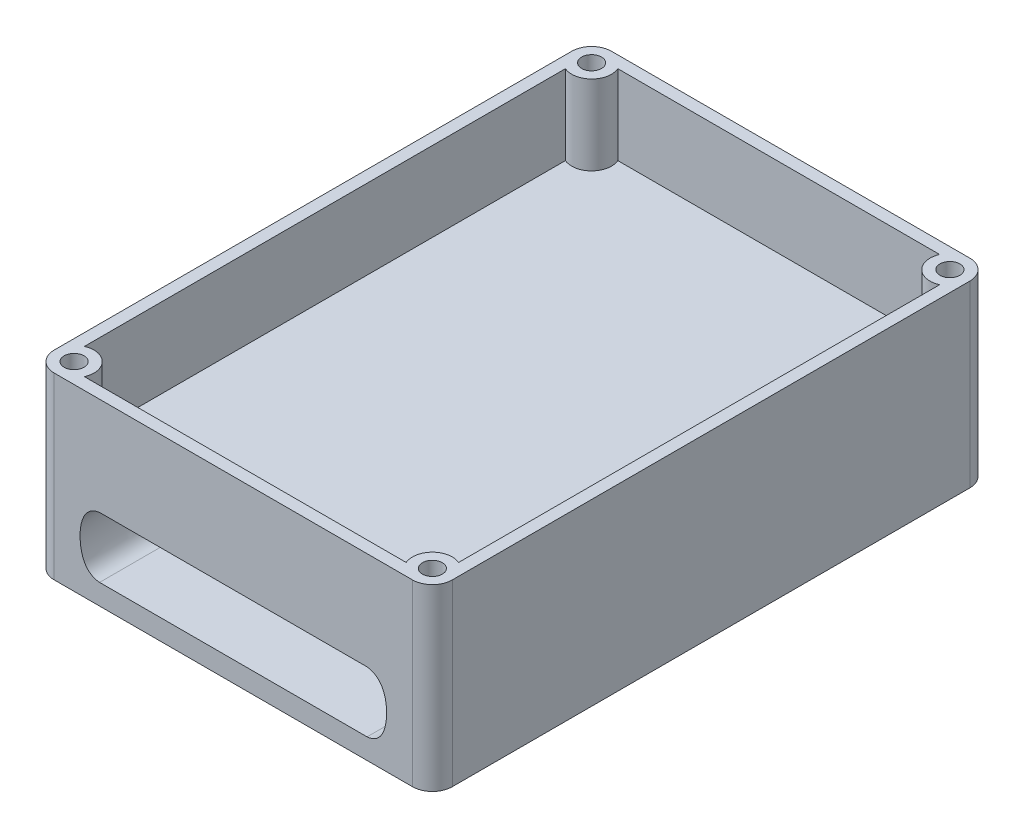
ISO-10303-21;
HEADER;
FILE_DESCRIPTION(('STEP AP214'),'2;1');
FILE_NAME('part.step','',(''),(''),'','','');
FILE_SCHEMA(('AUTOMOTIVE_DESIGN { 1 0 10303 214 1 1 1 1 }'));
ENDSEC;
DATA;
#1=APPLICATION_CONTEXT('core data for automotive mechanical design processes');
#2=APPLICATION_PROTOCOL_DEFINITION('international standard','automotive_design',2000,#1);
#3=PRODUCT_CONTEXT('',#1,'mechanical');
#4=PRODUCT('Part','Part','',(#3));
#5=PRODUCT_RELATED_PRODUCT_CATEGORY('part','',(#4));
#6=PRODUCT_DEFINITION_FORMATION('','',#4);
#7=PRODUCT_DEFINITION_CONTEXT('part definition',#1,'design');
#8=PRODUCT_DEFINITION('design','',#6,#7);
#9=PRODUCT_DEFINITION_SHAPE('','',#8);
#10=(LENGTH_UNIT() NAMED_UNIT(*) SI_UNIT(.MILLI.,.METRE.));
#11=(NAMED_UNIT(*) PLANE_ANGLE_UNIT() SI_UNIT($,.RADIAN.));
#12=(NAMED_UNIT(*) SI_UNIT($,.STERADIAN.) SOLID_ANGLE_UNIT());
#13=UNCERTAINTY_MEASURE_WITH_UNIT(LENGTH_MEASURE(1.E-05),#10,'distance_accuracy_value','');
#14=(GEOMETRIC_REPRESENTATION_CONTEXT(3) GLOBAL_UNCERTAINTY_ASSIGNED_CONTEXT((#13)) GLOBAL_UNIT_ASSIGNED_CONTEXT((#10,
#11,#12)) REPRESENTATION_CONTEXT('',''));
#15=CARTESIAN_POINT('',(0.,0.,0.));
#16=DIRECTION('',(0.,0.,1.));
#17=DIRECTION('',(1.,0.,0.));
#18=AXIS2_PLACEMENT_3D('',#15,#16,#17);
#19=CARTESIAN_POINT('',(0.,25.,-70.));
#20=DIRECTION('',(0.,0.,-1.));
#21=DIRECTION('',(-1.,0.,0.));
#22=AXIS2_PLACEMENT_3D('',#19,#20,#21);
#23=PLANE('',#22);
#24=DIRECTION('',(1.,0.,0.));
#25=VECTOR('',#24,1.);
#26=CARTESIAN_POINT('',(0.,0.,-70.));
#27=LINE('',#26,#25);
#28=CARTESIAN_POINT('',(-45.,0.,-70.));
#29=VERTEX_POINT('',#28);
#30=CARTESIAN_POINT('',(45.,0.,-70.));
#31=VERTEX_POINT('',#30);
#32=EDGE_CURVE('E579',#29,#31,#27,.T.);
#33=ORIENTED_EDGE('',*,*,#32,.F.);
#34=DIRECTION('',(0.,-1.,0.));
#35=VECTOR('',#34,1.);
#36=CARTESIAN_POINT('',(-45.,25.,-70.));
#37=LINE('',#36,#35);
#38=CARTESIAN_POINT('',(-45.,45.,-70.));
#39=VERTEX_POINT('',#38);
#40=EDGE_CURVE('E574',#39,#29,#37,.T.);
#41=ORIENTED_EDGE('',*,*,#40,.F.);
#42=DIRECTION('',(-1.,0.,0.));
#43=VECTOR('',#42,1.);
#44=CARTESIAN_POINT('',(0.,45.,-70.));
#45=LINE('',#44,#43);
#46=CARTESIAN_POINT('',(45.,45.,-70.));
#47=VERTEX_POINT('',#46);
#48=EDGE_CURVE('E983',#47,#39,#45,.T.);
#49=ORIENTED_EDGE('',*,*,#48,.F.);
#50=DIRECTION('',(0.,-1.,0.));
#51=VECTOR('',#50,1.);
#52=CARTESIAN_POINT('',(45.,25.,-70.));
#53=LINE('',#52,#51);
#54=EDGE_CURVE('E605',#47,#31,#53,.T.);
#55=ORIENTED_EDGE('',*,*,#54,.T.);
#56=EDGE_LOOP('',(#33,#41,#49,#55));
#57=FACE_BOUND('',#56,.T.);
#58=ADVANCED_FACE('F303',(#57),#23,.T.);
#59=CARTESIAN_POINT('',(-45.,25.,-65.));
#60=DIRECTION('',(0.,-1.,0.));
#61=DIRECTION('',(0.,0.,-1.));
#62=AXIS2_PLACEMENT_3D('',#59,#60,#61);
#63=CYLINDRICAL_SURFACE('',#62,5.00000000000001);
#64=CARTESIAN_POINT('',(-45.,0.,-65.));
#65=DIRECTION('',(0.,1.,0.));
#66=DIRECTION('',(0.,0.,1.));
#67=AXIS2_PLACEMENT_3D('',#64,#65,#66);
#68=CIRCLE('',#67,5.00000000000001);
#69=CARTESIAN_POINT('',(-50.,0.,-65.));
#70=VERTEX_POINT('',#69);
#71=EDGE_CURVE('E569',#29,#70,#68,.T.);
#72=ORIENTED_EDGE('',*,*,#71,.T.);
#73=DIRECTION('',(0.,-1.,0.));
#74=VECTOR('',#73,1.);
#75=CARTESIAN_POINT('',(-50.,25.,-65.));
#76=LINE('',#75,#74);
#77=CARTESIAN_POINT('',(-50.,45.,-65.));
#78=VERTEX_POINT('',#77);
#79=EDGE_CURVE('E572',#78,#70,#76,.T.);
#80=ORIENTED_EDGE('',*,*,#79,.F.);
#81=CARTESIAN_POINT('',(-45.,45.,-65.));
#82=DIRECTION('',(0.,1.,0.));
#83=DIRECTION('',(0.,0.,1.));
#84=AXIS2_PLACEMENT_3D('',#81,#82,#83);
#85=CIRCLE('',#84,5.00000000000001);
#86=EDGE_CURVE('E986',#39,#78,#85,.T.);
#87=ORIENTED_EDGE('',*,*,#86,.F.);
#88=ORIENTED_EDGE('',*,*,#40,.T.);
#89=EDGE_LOOP('',(#72,#80,#87,#88));
#90=FACE_BOUND('',#89,.T.);
#91=ADVANCED_FACE('F560',(#90),#63,.T.);
#92=CARTESIAN_POINT('',(-50.,25.,0.));
#93=DIRECTION('',(1.,0.,0.));
#94=DIRECTION('',(0.,0.,-1.));
#95=AXIS2_PLACEMENT_3D('',#92,#93,#94);
#96=PLANE('',#95);
#97=DIRECTION('',(0.,0.,1.));
#98=VECTOR('',#97,1.);
#99=CARTESIAN_POINT('',(-50.,0.,0.));
#100=LINE('',#99,#98);
#101=CARTESIAN_POINT('',(-50.,0.,65.));
#102=VERTEX_POINT('',#101);
#103=EDGE_CURVE('E578',#70,#102,#100,.T.);
#104=ORIENTED_EDGE('',*,*,#103,.T.);
#105=DIRECTION('',(0.,-1.,0.));
#106=VECTOR('',#105,1.);
#107=CARTESIAN_POINT('',(-50.,25.,65.));
#108=LINE('',#107,#106);
#109=CARTESIAN_POINT('',(-50.,45.,65.));
#110=VERTEX_POINT('',#109);
#111=EDGE_CURVE('E585',#110,#102,#108,.T.);
#112=ORIENTED_EDGE('',*,*,#111,.F.);
#113=DIRECTION('',(0.,0.,-1.));
#114=VECTOR('',#113,1.);
#115=CARTESIAN_POINT('',(-50.,45.,0.));
#116=LINE('',#115,#114);
#117=EDGE_CURVE('E584',#110,#78,#116,.T.);
#118=ORIENTED_EDGE('',*,*,#117,.T.);
#119=ORIENTED_EDGE('',*,*,#79,.T.);
#120=EDGE_LOOP('',(#104,#112,#118,#119));
#121=FACE_BOUND('',#120,.T.);
#122=ADVANCED_FACE('F557',(#121),#96,.F.);
#123=CARTESIAN_POINT('',(-45.,25.,65.));
#124=DIRECTION('',(0.,-1.,0.));
#125=DIRECTION('',(0.,0.,-1.));
#126=AXIS2_PLACEMENT_3D('',#123,#124,#125);
#127=CYLINDRICAL_SURFACE('',#126,5.);
#128=CARTESIAN_POINT('',(-45.,0.,65.));
#129=DIRECTION('',(0.,1.,0.));
#130=DIRECTION('',(0.,0.,1.));
#131=AXIS2_PLACEMENT_3D('',#128,#129,#130);
#132=CIRCLE('',#131,5.);
#133=CARTESIAN_POINT('',(-45.,0.,70.));
#134=VERTEX_POINT('',#133);
#135=EDGE_CURVE('E589',#102,#134,#132,.T.);
#136=ORIENTED_EDGE('',*,*,#135,.T.);
#137=DIRECTION('',(0.,-1.,0.));
#138=VECTOR('',#137,1.);
#139=CARTESIAN_POINT('',(-45.,25.,70.));
#140=LINE('',#139,#138);
#141=CARTESIAN_POINT('',(-45.,45.,70.));
#142=VERTEX_POINT('',#141);
#143=EDGE_CURVE('E614',#142,#134,#140,.T.);
#144=ORIENTED_EDGE('',*,*,#143,.F.);
#145=CARTESIAN_POINT('',(-45.,45.,65.));
#146=DIRECTION('',(0.,1.,0.));
#147=DIRECTION('',(0.,0.,1.));
#148=AXIS2_PLACEMENT_3D('',#145,#146,#147);
#149=CIRCLE('',#148,5.);
#150=EDGE_CURVE('E989',#110,#142,#149,.T.);
#151=ORIENTED_EDGE('',*,*,#150,.F.);
#152=ORIENTED_EDGE('',*,*,#111,.T.);
#153=EDGE_LOOP('',(#136,#144,#151,#152));
#154=FACE_BOUND('',#153,.T.);
#155=ADVANCED_FACE('F553',(#154),#127,.T.);
#156=CARTESIAN_POINT('',(0.,25.,70.));
#157=DIRECTION('',(0.,0.,-1.));
#158=DIRECTION('',(-1.,0.,0.));
#159=AXIS2_PLACEMENT_3D('',#156,#157,#158);
#160=PLANE('',#159);
#161=DIRECTION('',(1.,0.,0.));
#162=VECTOR('',#161,1.);
#163=CARTESIAN_POINT('',(-33.6002865543214,5.15230419856806,70.));
#164=LINE('',#163,#162);
#165=CARTESIAN_POINT('',(-33.6002865543214,5.15230419856806,70.));
#166=VERTEX_POINT('',#165);
#167=CARTESIAN_POINT('',(33.6002865543214,5.15230419856806,70.));
#168=VERTEX_POINT('',#167);
#169=EDGE_CURVE('E886',#166,#168,#164,.T.);
#170=ORIENTED_EDGE('',*,*,#169,.F.);
#171=CARTESIAN_POINT('',(-33.6002865543214,20.375134215543,70.));
#172=CARTESIAN_POINT('',(-37.2545812828891,19.906525535761,70.));
#173=CARTESIAN_POINT('',(-39.7449878753526,12.8653205492195,70.));
#174=CARTESIAN_POINT('',(-37.2553819192969,5.41906792669437,70.));
#175=CARTESIAN_POINT('',(-33.6002865543214,5.15230419856806,70.));
#176=B_SPLINE_CURVE_WITH_KNOTS('',3,(#171,#172,#173,#174,#175),.UNSPECIFIED.,.F.,.F.,(4,1,4),
(0.,0.5,1.),.UNSPECIFIED.);
#177=CARTESIAN_POINT('',(-33.6002865543214,20.375134215543,70.));
#178=VERTEX_POINT('',#177);
#179=EDGE_CURVE('E317',#178,#166,#176,.T.);
#180=ORIENTED_EDGE('',*,*,#179,.F.);
#181=DIRECTION('',(-1.,0.,0.));
#182=VECTOR('',#181,1.);
#183=CARTESIAN_POINT('',(-33.6002865543214,20.375134215543,70.));
#184=LINE('',#183,#182);
#185=CARTESIAN_POINT('',(33.6002865543214,20.375134215543,70.));
#186=VERTEX_POINT('',#185);
#187=EDGE_CURVE('E459',#186,#178,#184,.T.);
#188=ORIENTED_EDGE('',*,*,#187,.F.);
#189=CARTESIAN_POINT('',(33.6002865543214,5.15230419856806,70.));
#190=CARTESIAN_POINT('',(37.2553819192969,5.41906792669437,70.));
#191=CARTESIAN_POINT('',(39.7449878753526,13.0024427786275,70.));
#192=CARTESIAN_POINT('',(37.2545812828891,19.906525535761,70.));
#193=CARTESIAN_POINT('',(33.6002865543214,20.375134215543,70.));
#194=B_SPLINE_CURVE_WITH_KNOTS('',3,(#189,#190,#191,#192,#193),.UNSPECIFIED.,.F.,.F.,(4,1,4),
(0.,0.5,1.),.UNSPECIFIED.);
#195=EDGE_CURVE('E462',#168,#186,#194,.T.);
#196=ORIENTED_EDGE('',*,*,#195,.F.);
#197=EDGE_LOOP('',(#170,#180,#188,#196));
#198=FACE_BOUND('',#197,.T.);
#199=DIRECTION('',(1.,0.,0.));
#200=VECTOR('',#199,1.);
#201=CARTESIAN_POINT('',(0.,0.,70.));
#202=LINE('',#201,#200);
#203=CARTESIAN_POINT('',(45.,0.,70.));
#204=VERTEX_POINT('',#203);
#205=EDGE_CURVE('E591',#134,#204,#202,.T.);
#206=ORIENTED_EDGE('',*,*,#205,.T.);
#207=DIRECTION('',(0.,-1.,0.));
#208=VECTOR('',#207,1.);
#209=CARTESIAN_POINT('',(45.,25.,70.));
#210=LINE('',#209,#208);
#211=CARTESIAN_POINT('',(45.,45.,70.));
#212=VERTEX_POINT('',#211);
#213=EDGE_CURVE('E611',#212,#204,#210,.T.);
#214=ORIENTED_EDGE('',*,*,#213,.F.);
#215=DIRECTION('',(-1.,0.,0.));
#216=VECTOR('',#215,1.);
#217=CARTESIAN_POINT('',(0.,45.,70.));
#218=LINE('',#217,#216);
#219=EDGE_CURVE('E992',#212,#142,#218,.T.);
#220=ORIENTED_EDGE('',*,*,#219,.T.);
#221=ORIENTED_EDGE('',*,*,#143,.T.);
#222=EDGE_LOOP('',(#206,#214,#220,#221));
#223=FACE_BOUND('',#222,.T.);
#224=ADVANCED_FACE('F549',(#198,#223),#160,.F.);
#225=CARTESIAN_POINT('',(45.,25.,65.));
#226=DIRECTION('',(0.,-1.,0.));
#227=DIRECTION('',(0.,0.,-1.));
#228=AXIS2_PLACEMENT_3D('',#225,#226,#227);
#229=CYLINDRICAL_SURFACE('',#228,4.99999999999999);
#230=CARTESIAN_POINT('',(45.,0.,65.));
#231=DIRECTION('',(0.,1.,0.));
#232=DIRECTION('',(0.,0.,1.));
#233=AXIS2_PLACEMENT_3D('',#230,#231,#232);
#234=CIRCLE('',#233,4.99999999999999);
#235=CARTESIAN_POINT('',(50.,0.,65.));
#236=VERTEX_POINT('',#235);
#237=EDGE_CURVE('E596',#204,#236,#234,.T.);
#238=ORIENTED_EDGE('',*,*,#237,.T.);
#239=DIRECTION('',(0.,-1.,0.));
#240=VECTOR('',#239,1.);
#241=CARTESIAN_POINT('',(50.,25.,65.));
#242=LINE('',#241,#240);
#243=CARTESIAN_POINT('',(50.,45.,65.));
#244=VERTEX_POINT('',#243);
#245=EDGE_CURVE('E609',#244,#236,#242,.T.);
#246=ORIENTED_EDGE('',*,*,#245,.F.);
#247=CARTESIAN_POINT('',(45.,45.,65.));
#248=DIRECTION('',(0.,1.,0.));
#249=DIRECTION('',(0.,0.,1.));
#250=AXIS2_PLACEMENT_3D('',#247,#248,#249);
#251=CIRCLE('',#250,4.99999999999999);
#252=EDGE_CURVE('E995',#212,#244,#251,.T.);
#253=ORIENTED_EDGE('',*,*,#252,.F.);
#254=ORIENTED_EDGE('',*,*,#213,.T.);
#255=EDGE_LOOP('',(#238,#246,#253,#254));
#256=FACE_BOUND('',#255,.T.);
#257=ADVANCED_FACE('F545',(#256),#229,.T.);
#258=CARTESIAN_POINT('',(50.,25.,0.));
#259=DIRECTION('',(1.,0.,0.));
#260=DIRECTION('',(0.,0.,-1.));
#261=AXIS2_PLACEMENT_3D('',#258,#259,#260);
#262=PLANE('',#261);
#263=DIRECTION('',(0.,0.,1.));
#264=VECTOR('',#263,1.);
#265=CARTESIAN_POINT('',(50.,0.,0.));
#266=LINE('',#265,#264);
#267=CARTESIAN_POINT('',(50.,0.,-65.));
#268=VERTEX_POINT('',#267);
#269=EDGE_CURVE('E599',#268,#236,#266,.T.);
#270=ORIENTED_EDGE('',*,*,#269,.F.);
#271=DIRECTION('',(0.,-1.,0.));
#272=VECTOR('',#271,1.);
#273=CARTESIAN_POINT('',(50.,25.,-65.));
#274=LINE('',#273,#272);
#275=CARTESIAN_POINT('',(50.,45.,-65.));
#276=VERTEX_POINT('',#275);
#277=EDGE_CURVE('E607',#276,#268,#274,.T.);
#278=ORIENTED_EDGE('',*,*,#277,.F.);
#279=DIRECTION('',(0.,0.,-1.));
#280=VECTOR('',#279,1.);
#281=CARTESIAN_POINT('',(50.,45.,0.));
#282=LINE('',#281,#280);
#283=EDGE_CURVE('E998',#244,#276,#282,.T.);
#284=ORIENTED_EDGE('',*,*,#283,.F.);
#285=ORIENTED_EDGE('',*,*,#245,.T.);
#286=EDGE_LOOP('',(#270,#278,#284,#285));
#287=FACE_BOUND('',#286,.T.);
#288=ADVANCED_FACE('F541',(#287),#262,.T.);
#289=CARTESIAN_POINT('',(45.,25.,-65.));
#290=DIRECTION('',(0.,-1.,0.));
#291=DIRECTION('',(0.,0.,-1.));
#292=AXIS2_PLACEMENT_3D('',#289,#290,#291);
#293=CYLINDRICAL_SURFACE('',#292,5.);
#294=CARTESIAN_POINT('',(45.,0.,-65.));
#295=DIRECTION('',(0.,1.,0.));
#296=DIRECTION('',(0.,0.,1.));
#297=AXIS2_PLACEMENT_3D('',#294,#295,#296);
#298=CIRCLE('',#297,5.);
#299=EDGE_CURVE('E602',#31,#268,#298,.F.);
#300=ORIENTED_EDGE('',*,*,#299,.F.);
#301=ORIENTED_EDGE('',*,*,#54,.F.);
#302=CARTESIAN_POINT('',(45.,45.,-65.));
#303=DIRECTION('',(0.,1.,0.));
#304=DIRECTION('',(0.,0.,1.));
#305=AXIS2_PLACEMENT_3D('',#302,#303,#304);
#306=CIRCLE('',#305,5.);
#307=EDGE_CURVE('E960',#276,#47,#306,.T.);
#308=ORIENTED_EDGE('',*,*,#307,.F.);
#309=ORIENTED_EDGE('',*,*,#277,.T.);
#310=EDGE_LOOP('',(#300,#301,#308,#309));
#311=FACE_BOUND('',#310,.T.);
#312=ADVANCED_FACE('F537',(#311),#293,.T.);
#313=CARTESIAN_POINT('',(0.,0.,0.));
#314=DIRECTION('',(0.,1.,0.));
#315=DIRECTION('',(0.,0.,1.));
#316=AXIS2_PLACEMENT_3D('',#313,#314,#315);
#317=PLANE('',#316);
#318=ORIENTED_EDGE('',*,*,#32,.T.);
#319=ORIENTED_EDGE('',*,*,#299,.T.);
#320=ORIENTED_EDGE('',*,*,#269,.T.);
#321=ORIENTED_EDGE('',*,*,#237,.F.);
#322=ORIENTED_EDGE('',*,*,#205,.F.);
#323=ORIENTED_EDGE('',*,*,#135,.F.);
#324=ORIENTED_EDGE('',*,*,#103,.F.);
#325=ORIENTED_EDGE('',*,*,#71,.F.);
#326=EDGE_LOOP('',(#318,#319,#320,#321,#322,#323,#324,#325));
#327=FACE_BOUND('',#326,.T.);
#328=ADVANCED_FACE('F530',(#327),#317,.F.);
#329=CARTESIAN_POINT('',(45.,45.,-65.));
#330=DIRECTION('',(0.,1.,0.));
#331=DIRECTION('',(0.,0.,1.));
#332=AXIS2_PLACEMENT_3D('',#329,#330,#331);
#333=PLANE('',#332);
#334=CARTESIAN_POINT('',(45.,45.,65.));
#335=DIRECTION('',(0.,1.,0.));
#336=DIRECTION('',(0.,0.,1.));
#337=AXIS2_PLACEMENT_3D('',#334,#335,#336);
#338=CIRCLE('',#337,2.5);
#339=CARTESIAN_POINT('',(45.,45.,67.5));
#340=VERTEX_POINT('',#339);
#341=EDGE_CURVE('E906',#340,#340,#338,.T.);
#342=ORIENTED_EDGE('',*,*,#341,.F.);
#343=EDGE_LOOP('',(#342));
#344=FACE_BOUND('',#343,.T.);
#345=CARTESIAN_POINT('',(-45.,45.,-65.));
#346=DIRECTION('',(0.,1.,0.));
#347=DIRECTION('',(0.,0.,1.));
#348=AXIS2_PLACEMENT_3D('',#345,#346,#347);
#349=CIRCLE('',#348,2.5);
#350=CARTESIAN_POINT('',(-45.,45.,-62.5));
#351=VERTEX_POINT('',#350);
#352=EDGE_CURVE('E912',#351,#351,#349,.T.);
#353=ORIENTED_EDGE('',*,*,#352,.F.);
#354=EDGE_LOOP('',(#353));
#355=FACE_BOUND('',#354,.T.);
#356=CARTESIAN_POINT('',(-45.,45.,65.));
#357=DIRECTION('',(0.,1.,0.));
#358=DIRECTION('',(0.,0.,1.));
#359=AXIS2_PLACEMENT_3D('',#356,#357,#358);
#360=CIRCLE('',#359,5.);
#361=CARTESIAN_POINT('',(-40.4174243050442,45.,67.));
#362=VERTEX_POINT('',#361);
#363=CARTESIAN_POINT('',(-47.,45.,60.4174243050441));
#364=VERTEX_POINT('',#363);
#365=EDGE_CURVE('E915',#362,#364,#360,.T.);
#366=ORIENTED_EDGE('',*,*,#365,.T.);
#367=DIRECTION('',(0.,0.,1.));
#368=VECTOR('',#367,1.);
#369=CARTESIAN_POINT('',(-47.,45.,0.));
#370=LINE('',#369,#368);
#371=CARTESIAN_POINT('',(-47.,45.,-60.4174243050442));
#372=VERTEX_POINT('',#371);
#373=EDGE_CURVE('E918',#372,#364,#370,.T.);
#374=ORIENTED_EDGE('',*,*,#373,.F.);
#375=CARTESIAN_POINT('',(-45.,45.,-65.));
#376=DIRECTION('',(0.,1.,0.));
#377=DIRECTION('',(0.,0.,1.));
#378=AXIS2_PLACEMENT_3D('',#375,#376,#377);
#379=CIRCLE('',#378,5.);
#380=CARTESIAN_POINT('',(-40.4174243050442,45.,-67.));
#381=VERTEX_POINT('',#380);
#382=EDGE_CURVE('E921',#372,#381,#379,.T.);
#383=ORIENTED_EDGE('',*,*,#382,.T.);
#384=DIRECTION('',(-1.,0.,0.));
#385=VECTOR('',#384,1.);
#386=CARTESIAN_POINT('',(0.,45.,-67.));
#387=LINE('',#386,#385);
#388=CARTESIAN_POINT('',(40.4174243050442,45.,-67.));
#389=VERTEX_POINT('',#388);
#390=EDGE_CURVE('E924',#389,#381,#387,.T.);
#391=ORIENTED_EDGE('',*,*,#390,.F.);
#392=CARTESIAN_POINT('',(45.,45.,-65.));
#393=DIRECTION('',(0.,1.,0.));
#394=DIRECTION('',(0.,0.,1.));
#395=AXIS2_PLACEMENT_3D('',#392,#393,#394);
#396=CIRCLE('',#395,5.);
#397=CARTESIAN_POINT('',(47.,45.,-60.4174243050442));
#398=VERTEX_POINT('',#397);
#399=EDGE_CURVE('E926',#389,#398,#396,.T.);
#400=ORIENTED_EDGE('',*,*,#399,.T.);
#401=DIRECTION('',(0.,0.,1.));
#402=VECTOR('',#401,1.);
#403=CARTESIAN_POINT('',(47.,45.,0.));
#404=LINE('',#403,#402);
#405=CARTESIAN_POINT('',(47.,45.,60.4174243050441));
#406=VERTEX_POINT('',#405);
#407=EDGE_CURVE('E929',#398,#406,#404,.T.);
#408=ORIENTED_EDGE('',*,*,#407,.T.);
#409=CARTESIAN_POINT('',(45.,45.,65.));
#410=DIRECTION('',(0.,1.,0.));
#411=DIRECTION('',(0.,0.,1.));
#412=AXIS2_PLACEMENT_3D('',#409,#410,#411);
#413=CIRCLE('',#412,5.);
#414=CARTESIAN_POINT('',(40.4174243050442,45.,67.));
#415=VERTEX_POINT('',#414);
#416=EDGE_CURVE('E932',#406,#415,#413,.T.);
#417=ORIENTED_EDGE('',*,*,#416,.T.);
#418=DIRECTION('',(-1.,0.,0.));
#419=VECTOR('',#418,1.);
#420=CARTESIAN_POINT('',(0.,45.,67.));
#421=LINE('',#420,#419);
#422=EDGE_CURVE('E935',#415,#362,#421,.T.);
#423=ORIENTED_EDGE('',*,*,#422,.T.);
#424=EDGE_LOOP('',(#366,#374,#383,#391,#400,#408,#417,#423));
#425=FACE_BOUND('',#424,.T.);
#426=ORIENTED_EDGE('',*,*,#307,.T.);
#427=ORIENTED_EDGE('',*,*,#48,.T.);
#428=ORIENTED_EDGE('',*,*,#86,.T.);
#429=ORIENTED_EDGE('',*,*,#117,.F.);
#430=ORIENTED_EDGE('',*,*,#150,.T.);
#431=ORIENTED_EDGE('',*,*,#219,.F.);
#432=ORIENTED_EDGE('',*,*,#252,.T.);
#433=ORIENTED_EDGE('',*,*,#283,.T.);
#434=EDGE_LOOP('',(#426,#427,#428,#429,#430,#431,#432,#433));
#435=FACE_BOUND('',#434,.T.);
#436=CARTESIAN_POINT('',(45.,45.,-65.));
#437=DIRECTION('',(0.,1.,0.));
#438=DIRECTION('',(0.,0.,1.));
#439=AXIS2_PLACEMENT_3D('',#436,#437,#438);
#440=CIRCLE('',#439,2.5);
#441=CARTESIAN_POINT('',(45.,45.,-62.5));
#442=VERTEX_POINT('',#441);
#443=EDGE_CURVE('E909',#442,#442,#440,.T.);
#444=ORIENTED_EDGE('',*,*,#443,.F.);
#445=EDGE_LOOP('',(#444));
#446=FACE_BOUND('',#445,.T.);
#447=CARTESIAN_POINT('',(-45.,45.,65.));
#448=DIRECTION('',(0.,1.,0.));
#449=DIRECTION('',(0.,0.,1.));
#450=AXIS2_PLACEMENT_3D('',#447,#448,#449);
#451=CIRCLE('',#450,2.5);
#452=CARTESIAN_POINT('',(-45.,45.,67.5));
#453=VERTEX_POINT('',#452);
#454=EDGE_CURVE('E900',#453,#453,#451,.T.);
#455=ORIENTED_EDGE('',*,*,#454,.F.);
#456=EDGE_LOOP('',(#455));
#457=FACE_BOUND('',#456,.T.);
#458=ADVANCED_FACE('F526',(#344,#355,#425,#435,#446,#457),#333,.T.);
#459=CARTESIAN_POINT('',(-45.,45.,65.));
#460=DIRECTION('',(0.,-1.,0.));
#461=DIRECTION('',(0.,0.,-1.));
#462=AXIS2_PLACEMENT_3D('',#459,#460,#461);
#463=CYLINDRICAL_SURFACE('',#462,5.);
#464=CARTESIAN_POINT('',(-45.,25.,65.));
#465=DIRECTION('',(0.,1.,0.));
#466=DIRECTION('',(0.,0.,1.));
#467=AXIS2_PLACEMENT_3D('',#464,#465,#466);
#468=CIRCLE('',#467,5.);
#469=CARTESIAN_POINT('',(-40.4174243050442,25.,67.));
#470=VERTEX_POINT('',#469);
#471=CARTESIAN_POINT('',(-47.,25.,60.4174243050441));
#472=VERTEX_POINT('',#471);
#473=EDGE_CURVE('E325',#470,#472,#468,.T.);
#474=ORIENTED_EDGE('',*,*,#473,.T.);
#475=DIRECTION('',(0.,-1.,0.));
#476=VECTOR('',#475,1.);
#477=CARTESIAN_POINT('',(-47.,45.,60.4174243050441));
#478=LINE('',#477,#476);
#479=EDGE_CURVE('E938',#364,#472,#478,.T.);
#480=ORIENTED_EDGE('',*,*,#479,.F.);
#481=ORIENTED_EDGE('',*,*,#365,.F.);
#482=DIRECTION('',(0.,-1.,0.));
#483=VECTOR('',#482,1.);
#484=CARTESIAN_POINT('',(-40.4174243050442,45.,67.));
#485=LINE('',#484,#483);
#486=EDGE_CURVE('E958',#362,#470,#485,.T.);
#487=ORIENTED_EDGE('',*,*,#486,.T.);
#488=EDGE_LOOP('',(#474,#480,#481,#487));
#489=FACE_BOUND('',#488,.T.);
#490=ADVANCED_FACE('F500',(#489),#463,.T.);
#491=CARTESIAN_POINT('',(0.,45.,67.));
#492=DIRECTION('',(0.,0.,1.));
#493=DIRECTION('',(1.,0.,0.));
#494=AXIS2_PLACEMENT_3D('',#491,#492,#493);
#495=PLANE('',#494);
#496=DIRECTION('',(-1.,0.,0.));
#497=VECTOR('',#496,1.);
#498=CARTESIAN_POINT('',(0.,25.,67.));
#499=LINE('',#498,#497);
#500=CARTESIAN_POINT('',(40.4174243050442,25.,67.));
#501=VERTEX_POINT('',#500);
#502=EDGE_CURVE('E919',#501,#470,#499,.T.);
#503=ORIENTED_EDGE('',*,*,#502,.T.);
#504=ORIENTED_EDGE('',*,*,#486,.F.);
#505=ORIENTED_EDGE('',*,*,#422,.F.);
#506=DIRECTION('',(0.,-1.,0.));
#507=VECTOR('',#506,1.);
#508=CARTESIAN_POINT('',(40.4174243050442,45.,67.));
#509=LINE('',#508,#507);
#510=EDGE_CURVE('E961',#415,#501,#509,.T.);
#511=ORIENTED_EDGE('',*,*,#510,.T.);
#512=EDGE_LOOP('',(#503,#504,#505,#511));
#513=FACE_BOUND('',#512,.T.);
#514=ADVANCED_FACE('F496',(#513),#495,.F.);
#515=CARTESIAN_POINT('',(45.,45.,65.));
#516=DIRECTION('',(0.,-1.,0.));
#517=DIRECTION('',(0.,0.,-1.));
#518=AXIS2_PLACEMENT_3D('',#515,#516,#517);
#519=CYLINDRICAL_SURFACE('',#518,5.);
#520=CARTESIAN_POINT('',(45.,25.,65.));
#521=DIRECTION('',(0.,1.,0.));
#522=DIRECTION('',(0.,0.,1.));
#523=AXIS2_PLACEMENT_3D('',#520,#521,#522);
#524=CIRCLE('',#523,5.);
#525=CARTESIAN_POINT('',(47.,25.,60.4174243050441));
#526=VERTEX_POINT('',#525);
#527=EDGE_CURVE('E953',#526,#501,#524,.T.);
#528=ORIENTED_EDGE('',*,*,#527,.T.);
#529=ORIENTED_EDGE('',*,*,#510,.F.);
#530=ORIENTED_EDGE('',*,*,#416,.F.);
#531=DIRECTION('',(0.,-1.,0.));
#532=VECTOR('',#531,1.);
#533=CARTESIAN_POINT('',(47.,45.,60.4174243050441));
#534=LINE('',#533,#532);
#535=EDGE_CURVE('E964',#406,#526,#534,.T.);
#536=ORIENTED_EDGE('',*,*,#535,.T.);
#537=EDGE_LOOP('',(#528,#529,#530,#536));
#538=FACE_BOUND('',#537,.T.);
#539=ADVANCED_FACE('F499',(#538),#519,.T.);
#540=CARTESIAN_POINT('',(47.,45.,0.));
#541=DIRECTION('',(1.,0.,0.));
#542=DIRECTION('',(0.,0.,-1.));
#543=AXIS2_PLACEMENT_3D('',#540,#541,#542);
#544=PLANE('',#543);
#545=DIRECTION('',(0.,0.,1.));
#546=VECTOR('',#545,1.);
#547=CARTESIAN_POINT('',(47.,25.,0.));
#548=LINE('',#547,#546);
#549=CARTESIAN_POINT('',(47.,25.,-60.4174243050442));
#550=VERTEX_POINT('',#549);
#551=EDGE_CURVE('E950',#550,#526,#548,.T.);
#552=ORIENTED_EDGE('',*,*,#551,.T.);
#553=ORIENTED_EDGE('',*,*,#535,.F.);
#554=ORIENTED_EDGE('',*,*,#407,.F.);
#555=DIRECTION('',(0.,-1.,0.));
#556=VECTOR('',#555,1.);
#557=CARTESIAN_POINT('',(47.,45.,-60.4174243050442));
#558=LINE('',#557,#556);
#559=EDGE_CURVE('E967',#398,#550,#558,.T.);
#560=ORIENTED_EDGE('',*,*,#559,.T.);
#561=EDGE_LOOP('',(#552,#553,#554,#560));
#562=FACE_BOUND('',#561,.T.);
#563=ADVANCED_FACE('F504',(#562),#544,.F.);
#564=CARTESIAN_POINT('',(45.,45.,-65.));
#565=DIRECTION('',(0.,-1.,0.));
#566=DIRECTION('',(0.,0.,-1.));
#567=AXIS2_PLACEMENT_3D('',#564,#565,#566);
#568=CYLINDRICAL_SURFACE('',#567,5.);
#569=CARTESIAN_POINT('',(45.,25.,-65.));
#570=DIRECTION('',(0.,1.,0.));
#571=DIRECTION('',(0.,0.,1.));
#572=AXIS2_PLACEMENT_3D('',#569,#570,#571);
#573=CIRCLE('',#572,5.);
#574=CARTESIAN_POINT('',(40.4174243050442,25.,-67.));
#575=VERTEX_POINT('',#574);
#576=EDGE_CURVE('E947',#575,#550,#573,.T.);
#577=ORIENTED_EDGE('',*,*,#576,.T.);
#578=ORIENTED_EDGE('',*,*,#559,.F.);
#579=ORIENTED_EDGE('',*,*,#399,.F.);
#580=DIRECTION('',(0.,-1.,0.));
#581=VECTOR('',#580,1.);
#582=CARTESIAN_POINT('',(40.4174243050442,45.,-67.));
#583=LINE('',#582,#581);
#584=EDGE_CURVE('E970',#389,#575,#583,.T.);
#585=ORIENTED_EDGE('',*,*,#584,.T.);
#586=EDGE_LOOP('',(#577,#578,#579,#585));
#587=FACE_BOUND('',#586,.T.);
#588=ADVANCED_FACE('F508',(#587),#568,.T.);
#589=CARTESIAN_POINT('',(0.,45.,-67.));
#590=DIRECTION('',(0.,0.,1.));
#591=DIRECTION('',(1.,0.,0.));
#592=AXIS2_PLACEMENT_3D('',#589,#590,#591);
#593=PLANE('',#592);
#594=DIRECTION('',(-1.,0.,0.));
#595=VECTOR('',#594,1.);
#596=CARTESIAN_POINT('',(0.,25.,-67.));
#597=LINE('',#596,#595);
#598=CARTESIAN_POINT('',(-40.4174243050442,25.,-67.));
#599=VERTEX_POINT('',#598);
#600=EDGE_CURVE('E945',#575,#599,#597,.T.);
#601=ORIENTED_EDGE('',*,*,#600,.F.);
#602=ORIENTED_EDGE('',*,*,#584,.F.);
#603=ORIENTED_EDGE('',*,*,#390,.T.);
#604=DIRECTION('',(0.,-1.,0.));
#605=VECTOR('',#604,1.);
#606=CARTESIAN_POINT('',(-40.4174243050442,45.,-67.));
#607=LINE('',#606,#605);
#608=EDGE_CURVE('E973',#381,#599,#607,.T.);
#609=ORIENTED_EDGE('',*,*,#608,.T.);
#610=EDGE_LOOP('',(#601,#602,#603,#609));
#611=FACE_BOUND('',#610,.T.);
#612=ADVANCED_FACE('F512',(#611),#593,.T.);
#613=CARTESIAN_POINT('',(-45.,45.,-65.));
#614=DIRECTION('',(0.,-1.,0.));
#615=DIRECTION('',(0.,0.,-1.));
#616=AXIS2_PLACEMENT_3D('',#613,#614,#615);
#617=CYLINDRICAL_SURFACE('',#616,5.);
#618=CARTESIAN_POINT('',(-45.,25.,-65.));
#619=DIRECTION('',(0.,1.,0.));
#620=DIRECTION('',(0.,0.,1.));
#621=AXIS2_PLACEMENT_3D('',#618,#619,#620);
#622=CIRCLE('',#621,5.);
#623=CARTESIAN_POINT('',(-47.,25.,-60.4174243050442));
#624=VERTEX_POINT('',#623);
#625=EDGE_CURVE('E942',#624,#599,#622,.T.);
#626=ORIENTED_EDGE('',*,*,#625,.T.);
#627=ORIENTED_EDGE('',*,*,#608,.F.);
#628=ORIENTED_EDGE('',*,*,#382,.F.);
#629=DIRECTION('',(0.,-1.,0.));
#630=VECTOR('',#629,1.);
#631=CARTESIAN_POINT('',(-47.,45.,-60.4174243050442));
#632=LINE('',#631,#630);
#633=EDGE_CURVE('E976',#372,#624,#632,.T.);
#634=ORIENTED_EDGE('',*,*,#633,.T.);
#635=EDGE_LOOP('',(#626,#627,#628,#634));
#636=FACE_BOUND('',#635,.T.);
#637=ADVANCED_FACE('F516',(#636),#617,.T.);
#638=CARTESIAN_POINT('',(-47.,45.,0.));
#639=DIRECTION('',(1.,0.,0.));
#640=DIRECTION('',(0.,0.,-1.));
#641=AXIS2_PLACEMENT_3D('',#638,#639,#640);
#642=PLANE('',#641);
#643=DIRECTION('',(0.,0.,1.));
#644=VECTOR('',#643,1.);
#645=CARTESIAN_POINT('',(-47.,25.,0.));
#646=LINE('',#645,#644);
#647=EDGE_CURVE('E940',#624,#472,#646,.T.);
#648=ORIENTED_EDGE('',*,*,#647,.F.);
#649=ORIENTED_EDGE('',*,*,#633,.F.);
#650=ORIENTED_EDGE('',*,*,#373,.T.);
#651=ORIENTED_EDGE('',*,*,#479,.T.);
#652=EDGE_LOOP('',(#648,#649,#650,#651));
#653=FACE_BOUND('',#652,.T.);
#654=ADVANCED_FACE('F494',(#653),#642,.T.);
#655=CARTESIAN_POINT('',(-45.,45.,-65.));
#656=DIRECTION('',(0.,-1.,0.));
#657=DIRECTION('',(0.,0.,-1.));
#658=AXIS2_PLACEMENT_3D('',#655,#656,#657);
#659=CYLINDRICAL_SURFACE('',#658,2.5);
#660=ORIENTED_EDGE('',*,*,#352,.T.);
#661=EDGE_LOOP('',(#660));
#662=FACE_BOUND('',#661,.T.);
#663=CARTESIAN_POINT('',(-45.,25.,-65.));
#664=DIRECTION('',(0.,1.,0.));
#665=DIRECTION('',(0.,0.,1.));
#666=AXIS2_PLACEMENT_3D('',#663,#664,#665);
#667=CIRCLE('',#666,2.5);
#668=CARTESIAN_POINT('',(-45.,25.,-62.5));
#669=VERTEX_POINT('',#668);
#670=EDGE_CURVE('E12',#669,#669,#667,.F.);
#671=ORIENTED_EDGE('',*,*,#670,.T.);
#672=EDGE_LOOP('',(#671));
#673=FACE_BOUND('',#672,.T.);
#674=ADVANCED_FACE('F490',(#662,#673),#659,.F.);
#675=CARTESIAN_POINT('',(45.,45.,-65.));
#676=DIRECTION('',(0.,-1.,0.));
#677=DIRECTION('',(0.,0.,-1.));
#678=AXIS2_PLACEMENT_3D('',#675,#676,#677);
#679=CYLINDRICAL_SURFACE('',#678,2.5);
#680=ORIENTED_EDGE('',*,*,#443,.T.);
#681=EDGE_LOOP('',(#680));
#682=FACE_BOUND('',#681,.T.);
#683=CARTESIAN_POINT('',(45.,25.,-65.));
#684=DIRECTION('',(0.,1.,0.));
#685=DIRECTION('',(0.,0.,1.));
#686=AXIS2_PLACEMENT_3D('',#683,#684,#685);
#687=CIRCLE('',#686,2.5);
#688=CARTESIAN_POINT('',(45.,25.,-62.5));
#689=VERTEX_POINT('',#688);
#690=EDGE_CURVE('E310',#689,#689,#687,.F.);
#691=ORIENTED_EDGE('',*,*,#690,.T.);
#692=EDGE_LOOP('',(#691));
#693=FACE_BOUND('',#692,.T.);
#694=ADVANCED_FACE('F486',(#682,#693),#679,.F.);
#695=CARTESIAN_POINT('',(45.,45.,65.));
#696=DIRECTION('',(0.,-1.,0.));
#697=DIRECTION('',(0.,0.,-1.));
#698=AXIS2_PLACEMENT_3D('',#695,#696,#697);
#699=CYLINDRICAL_SURFACE('',#698,2.5);
#700=ORIENTED_EDGE('',*,*,#341,.T.);
#701=EDGE_LOOP('',(#700));
#702=FACE_BOUND('',#701,.T.);
#703=CARTESIAN_POINT('',(45.,25.,65.));
#704=DIRECTION('',(0.,1.,0.));
#705=DIRECTION('',(0.,0.,1.));
#706=AXIS2_PLACEMENT_3D('',#703,#704,#705);
#707=CIRCLE('',#706,2.5);
#708=CARTESIAN_POINT('',(45.,25.,67.5));
#709=VERTEX_POINT('',#708);
#710=EDGE_CURVE('E622',#709,#709,#707,.F.);
#711=ORIENTED_EDGE('',*,*,#710,.T.);
#712=EDGE_LOOP('',(#711));
#713=FACE_BOUND('',#712,.T.);
#714=ADVANCED_FACE('F482',(#702,#713),#699,.F.);
#715=CARTESIAN_POINT('',(-45.,45.,65.));
#716=DIRECTION('',(0.,-1.,0.));
#717=DIRECTION('',(0.,0.,-1.));
#718=AXIS2_PLACEMENT_3D('',#715,#716,#717);
#719=CYLINDRICAL_SURFACE('',#718,2.5);
#720=ORIENTED_EDGE('',*,*,#454,.T.);
#721=EDGE_LOOP('',(#720));
#722=FACE_BOUND('',#721,.T.);
#723=CARTESIAN_POINT('',(-45.,25.,65.));
#724=DIRECTION('',(0.,1.,0.));
#725=DIRECTION('',(0.,0.,1.));
#726=AXIS2_PLACEMENT_3D('',#723,#724,#725);
#727=CIRCLE('',#726,2.5);
#728=CARTESIAN_POINT('',(-45.,25.,67.5));
#729=VERTEX_POINT('',#728);
#730=EDGE_CURVE('E619',#729,#729,#727,.F.);
#731=ORIENTED_EDGE('',*,*,#730,.T.);
#732=EDGE_LOOP('',(#731));
#733=FACE_BOUND('',#732,.T.);
#734=ADVANCED_FACE('F478',(#722,#733),#719,.F.);
#735=CARTESIAN_POINT('',(0.,25.,0.));
#736=DIRECTION('',(0.,1.,0.));
#737=DIRECTION('',(0.,0.,1.));
#738=AXIS2_PLACEMENT_3D('',#735,#736,#737);
#739=PLANE('',#738);
#740=ORIENTED_EDGE('',*,*,#730,.F.);
#741=EDGE_LOOP('',(#740));
#742=FACE_BOUND('',#741,.T.);
#743=ADVANCED_FACE('F481',(#742),#739,.T.);
#744=ORIENTED_EDGE('',*,*,#710,.F.);
#745=EDGE_LOOP('',(#744));
#746=FACE_BOUND('',#745,.T.);
#747=ADVANCED_FACE('F630',(#746),#739,.T.);
#748=ORIENTED_EDGE('',*,*,#690,.F.);
#749=EDGE_LOOP('',(#748));
#750=FACE_BOUND('',#749,.T.);
#751=ADVANCED_FACE('F628',(#750),#739,.T.);
#752=ORIENTED_EDGE('',*,*,#670,.F.);
#753=EDGE_LOOP('',(#752));
#754=FACE_BOUND('',#753,.T.);
#755=ADVANCED_FACE('F534',(#754),#739,.T.);
#756=ORIENTED_EDGE('',*,*,#647,.T.);
#757=ORIENTED_EDGE('',*,*,#473,.F.);
#758=ORIENTED_EDGE('',*,*,#502,.F.);
#759=ORIENTED_EDGE('',*,*,#527,.F.);
#760=ORIENTED_EDGE('',*,*,#551,.F.);
#761=ORIENTED_EDGE('',*,*,#576,.F.);
#762=ORIENTED_EDGE('',*,*,#600,.T.);
#763=ORIENTED_EDGE('',*,*,#625,.F.);
#764=EDGE_LOOP('',(#756,#757,#758,#759,#760,#761,#762,#763));
#765=FACE_BOUND('',#764,.T.);
#766=ADVANCED_FACE('F476',(#765),#739,.T.);
#767=CARTESIAN_POINT('',(-33.6002865543214,20.375134215543,-60.));
#768=CARTESIAN_POINT('',(-37.2545812828891,19.906525535761,-60.));
#769=CARTESIAN_POINT('',(-39.7449878753526,12.8653205492195,-60.));
#770=CARTESIAN_POINT('',(-37.2553819192969,5.41906792669437,-60.));
#771=CARTESIAN_POINT('',(-33.6002865543214,5.15230419856806,-60.));
#772=B_SPLINE_CURVE_WITH_KNOTS('',3,(#767,#768,#769,#770,#771),.UNSPECIFIED.,.F.,.F.,(4,1,4),
(0.,0.5,1.),.UNSPECIFIED.);
#773=DIRECTION('',(0.,0.,1.));
#774=VECTOR('',#773,1.);
#775=SURFACE_OF_LINEAR_EXTRUSION('',#772,#774);
#776=ORIENTED_EDGE('',*,*,#179,.T.);
#777=DIRECTION('',(0.,0.,1.));
#778=VECTOR('',#777,1.);
#779=CARTESIAN_POINT('',(-33.6002865543214,5.15230419856806,-60.));
#780=LINE('',#779,#778);
#781=CARTESIAN_POINT('',(-33.6002865543214,5.15230419856806,-60.));
#782=VERTEX_POINT('',#781);
#783=EDGE_CURVE('E437',#782,#166,#780,.T.);
#784=ORIENTED_EDGE('',*,*,#783,.F.);
#785=CARTESIAN_POINT('',(-33.6002865543214,20.375134215543,-60.));
#786=VERTEX_POINT('',#785);
#787=EDGE_CURVE('E441',#786,#782,#772,.T.);
#788=ORIENTED_EDGE('',*,*,#787,.F.);
#789=DIRECTION('',(0.,0.,1.));
#790=VECTOR('',#789,1.);
#791=CARTESIAN_POINT('',(-33.6002865543214,20.375134215543,-60.));
#792=LINE('',#791,#790);
#793=EDGE_CURVE('E898',#786,#178,#792,.T.);
#794=ORIENTED_EDGE('',*,*,#793,.T.);
#795=EDGE_LOOP('',(#776,#784,#788,#794));
#796=FACE_BOUND('',#795,.T.);
#797=ADVANCED_FACE('F439',(#796),#775,.F.);
#798=CARTESIAN_POINT('',(-33.6002865543214,20.375134215543,-60.));
#799=DIRECTION('',(0.,1.,0.));
#800=DIRECTION('',(0.,0.,1.));
#801=AXIS2_PLACEMENT_3D('',#798,#799,#800);
#802=PLANE('',#801);
#803=ORIENTED_EDGE('',*,*,#187,.T.);
#804=ORIENTED_EDGE('',*,*,#793,.F.);
#805=DIRECTION('',(-1.,0.,0.));
#806=VECTOR('',#805,1.);
#807=CARTESIAN_POINT('',(-33.6002865543214,20.375134215543,-60.));
#808=LINE('',#807,#806);
#809=CARTESIAN_POINT('',(33.6002865543214,20.375134215543,-60.));
#810=VERTEX_POINT('',#809);
#811=EDGE_CURVE('E447',#810,#786,#808,.T.);
#812=ORIENTED_EDGE('',*,*,#811,.F.);
#813=DIRECTION('',(0.,0.,1.));
#814=VECTOR('',#813,1.);
#815=CARTESIAN_POINT('',(33.6002865543214,20.375134215543,-60.));
#816=LINE('',#815,#814);
#817=EDGE_CURVE('E901',#810,#186,#816,.T.);
#818=ORIENTED_EDGE('',*,*,#817,.T.);
#819=EDGE_LOOP('',(#803,#804,#812,#818));
#820=FACE_BOUND('',#819,.T.);
#821=ADVANCED_FACE('F475',(#820),#802,.F.);
#822=CARTESIAN_POINT('',(33.6002865543214,5.15230419856806,-60.));
#823=CARTESIAN_POINT('',(37.2553819192969,5.41906792669437,-60.));
#824=CARTESIAN_POINT('',(39.7449878753526,13.0024427786275,-60.));
#825=CARTESIAN_POINT('',(37.2545812828891,19.906525535761,-60.));
#826=CARTESIAN_POINT('',(33.6002865543214,20.375134215543,-60.));
#827=B_SPLINE_CURVE_WITH_KNOTS('',3,(#822,#823,#824,#825,#826),.UNSPECIFIED.,.F.,.F.,(4,1,4),
(0.,0.5,1.),.UNSPECIFIED.);
#828=DIRECTION('',(0.,0.,1.));
#829=VECTOR('',#828,1.);
#830=SURFACE_OF_LINEAR_EXTRUSION('',#827,#829);
#831=ORIENTED_EDGE('',*,*,#195,.T.);
#832=ORIENTED_EDGE('',*,*,#817,.F.);
#833=CARTESIAN_POINT('',(33.6002865543214,5.15230419856806,-60.));
#834=VERTEX_POINT('',#833);
#835=EDGE_CURVE('E455',#834,#810,#827,.T.);
#836=ORIENTED_EDGE('',*,*,#835,.F.);
#837=DIRECTION('',(0.,0.,1.));
#838=VECTOR('',#837,1.);
#839=CARTESIAN_POINT('',(33.6002865543214,5.15230419856806,-60.));
#840=LINE('',#839,#838);
#841=EDGE_CURVE('E446',#834,#168,#840,.T.);
#842=ORIENTED_EDGE('',*,*,#841,.T.);
#843=EDGE_LOOP('',(#831,#832,#836,#842));
#844=FACE_BOUND('',#843,.T.);
#845=ADVANCED_FACE('F832',(#844),#830,.F.);
#846=CARTESIAN_POINT('',(-33.6002865543214,5.15230419856806,-60.));
#847=DIRECTION('',(0.,-1.,0.));
#848=DIRECTION('',(0.,0.,-1.));
#849=AXIS2_PLACEMENT_3D('',#846,#847,#848);
#850=PLANE('',#849);
#851=ORIENTED_EDGE('',*,*,#169,.T.);
#852=ORIENTED_EDGE('',*,*,#841,.F.);
#853=DIRECTION('',(1.,0.,0.));
#854=VECTOR('',#853,1.);
#855=CARTESIAN_POINT('',(-33.6002865543214,5.15230419856806,-60.));
#856=LINE('',#855,#854);
#857=EDGE_CURVE('E450',#782,#834,#856,.T.);
#858=ORIENTED_EDGE('',*,*,#857,.F.);
#859=ORIENTED_EDGE('',*,*,#783,.T.);
#860=EDGE_LOOP('',(#851,#852,#858,#859));
#861=FACE_BOUND('',#860,.T.);
#862=ADVANCED_FACE('F451',(#861),#850,.F.);
#863=CARTESIAN_POINT('',(-38.4999847382228,12.7640586402236,-60.));
#864=DIRECTION('',(0.,0.,-1.));
#865=DIRECTION('',(-1.,0.,0.));
#866=AXIS2_PLACEMENT_3D('',#863,#864,#865);
#867=PLANE('',#866);
#868=ORIENTED_EDGE('',*,*,#787,.T.);
#869=ORIENTED_EDGE('',*,*,#857,.T.);
#870=ORIENTED_EDGE('',*,*,#835,.T.);
#871=ORIENTED_EDGE('',*,*,#811,.T.);
#872=EDGE_LOOP('',(#868,#869,#870,#871));
#873=FACE_BOUND('',#872,.T.);
#874=ADVANCED_FACE('F457',(#873),#867,.F.);
#875=CLOSED_SHELL('',(#58,#91,#122,#155,#224,#257,#288,#312,#328,#458,#490,#514,#539,#563,#588,
#612,#637,#654,#674,#694,#714,#734,#743,#747,#751,#755,#766,#797,#821,#845,#862,#874));
#876=MANIFOLD_SOLID_BREP('B2',#875);
#877=ADVANCED_BREP_SHAPE_REPRESENTATION('',(#18,#876),#14);
#878=SHAPE_DEFINITION_REPRESENTATION(#9,#877);
ENDSEC;
END-ISO-10303-21;
